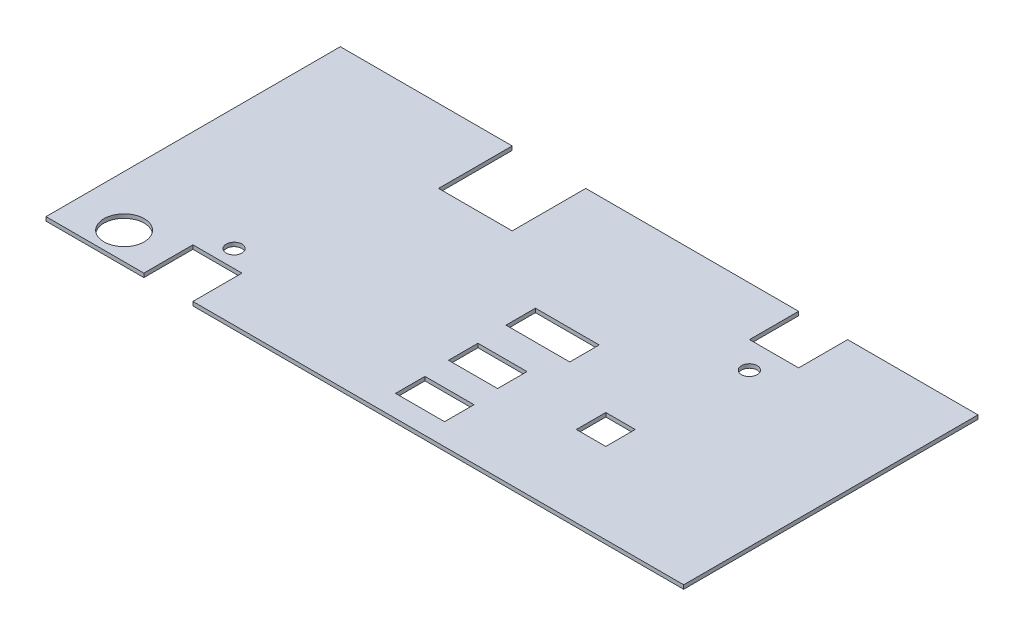
ISO-10303-21;
HEADER;
FILE_DESCRIPTION(('STEP AP214'),'2;1');
FILE_NAME('part.step','',(''),(''),'','','');
FILE_SCHEMA(('AUTOMOTIVE_DESIGN { 1 0 10303 214 1 1 1 1 }'));
ENDSEC;
DATA;
#1=APPLICATION_CONTEXT('core data for automotive mechanical design processes');
#2=APPLICATION_PROTOCOL_DEFINITION('international standard','automotive_design',2000,#1);
#3=PRODUCT_CONTEXT('',#1,'mechanical');
#4=PRODUCT('Part','Part','',(#3));
#5=PRODUCT_RELATED_PRODUCT_CATEGORY('part','',(#4));
#6=PRODUCT_DEFINITION_FORMATION('','',#4);
#7=PRODUCT_DEFINITION_CONTEXT('part definition',#1,'design');
#8=PRODUCT_DEFINITION('design','',#6,#7);
#9=PRODUCT_DEFINITION_SHAPE('','',#8);
#10=(LENGTH_UNIT() NAMED_UNIT(*) SI_UNIT(.MILLI.,.METRE.));
#11=(NAMED_UNIT(*) PLANE_ANGLE_UNIT() SI_UNIT($,.RADIAN.));
#12=(NAMED_UNIT(*) SI_UNIT($,.STERADIAN.) SOLID_ANGLE_UNIT());
#13=UNCERTAINTY_MEASURE_WITH_UNIT(LENGTH_MEASURE(1.E-05),#10,'distance_accuracy_value','');
#14=(GEOMETRIC_REPRESENTATION_CONTEXT(3) GLOBAL_UNCERTAINTY_ASSIGNED_CONTEXT((#13)) GLOBAL_UNIT_ASSIGNED_CONTEXT((#10,
#11,#12)) REPRESENTATION_CONTEXT('',''));
#15=CARTESIAN_POINT('',(0.,0.,0.));
#16=DIRECTION('',(0.,0.,1.));
#17=DIRECTION('',(1.,0.,0.));
#18=AXIS2_PLACEMENT_3D('',#15,#16,#17);
#19=CARTESIAN_POINT('',(0.,0.8,0.));
#20=DIRECTION('',(0.,1.,0.));
#21=DIRECTION('',(0.,0.,1.));
#22=AXIS2_PLACEMENT_3D('',#19,#20,#21);
#23=PLANE('',#22);
#24=CARTESIAN_POINT('',(33.7947660043208,0.8,-14.5908429620137));
#25=DIRECTION('',(0.,1.,0.));
#26=DIRECTION('',(0.,0.,1.));
#27=AXIS2_PLACEMENT_3D('',#24,#25,#26);
#28=CIRCLE('',#27,1.6);
#29=CARTESIAN_POINT('',(33.7947660043208,0.8,-12.9908429620137));
#30=VERTEX_POINT('',#29);
#31=EDGE_CURVE('E384',#30,#30,#28,.T.);
#32=ORIENTED_EDGE('',*,*,#31,.F.);
#33=EDGE_LOOP('',(#32));
#34=FACE_BOUND('',#33,.T.);
#35=CARTESIAN_POINT('',(-54.636005030327,0.8,24.4481071776723));
#36=DIRECTION('',(0.,1.,0.));
#37=DIRECTION('',(0.,0.,1.));
#38=AXIS2_PLACEMENT_3D('',#35,#36,#37);
#39=CIRCLE('',#38,4.1);
#40=CARTESIAN_POINT('',(-54.636005030327,0.8,28.5481071776723));
#41=VERTEX_POINT('',#40);
#42=EDGE_CURVE('E383',#41,#41,#39,.T.);
#43=ORIENTED_EDGE('',*,*,#42,.F.);
#44=EDGE_LOOP('',(#43));
#45=FACE_BOUND('',#44,.T.);
#46=CARTESIAN_POINT('',(-40.1851229344211,0.8,16.4677693038138));
#47=DIRECTION('',(0.,1.,0.));
#48=DIRECTION('',(0.,0.,1.));
#49=AXIS2_PLACEMENT_3D('',#46,#47,#48);
#50=CIRCLE('',#49,1.6);
#51=CARTESIAN_POINT('',(-40.1851229344211,0.8,18.0677693038138));
#52=VERTEX_POINT('',#51);
#53=EDGE_CURVE('E390',#52,#52,#50,.T.);
#54=ORIENTED_EDGE('',*,*,#53,.F.);
#55=EDGE_LOOP('',(#54));
#56=FACE_BOUND('',#55,.T.);
#57=DIRECTION('',(-1.,0.,0.));
#58=VECTOR('',#57,1.);
#59=CARTESIAN_POINT('',(-65.,0.8,-30.));
#60=LINE('',#59,#58);
#61=CARTESIAN_POINT('',(65.,0.8,-30.));
#62=VERTEX_POINT('',#61);
#63=CARTESIAN_POINT('',(38.4256480296742,0.8,-30.));
#64=VERTEX_POINT('',#63);
#65=EDGE_CURVE('E471',#62,#64,#60,.T.);
#66=ORIENTED_EDGE('',*,*,#65,.T.);
#67=DIRECTION('',(0.,0.,1.));
#68=VECTOR('',#67,1.);
#69=CARTESIAN_POINT('',(38.4256480296742,0.8,0.));
#70=LINE('',#69,#68);
#71=CARTESIAN_POINT('',(38.4256480296742,0.8,-20.0048506979894));
#72=VERTEX_POINT('',#71);
#73=EDGE_CURVE('E429',#64,#72,#70,.T.);
#74=ORIENTED_EDGE('',*,*,#73,.T.);
#75=DIRECTION('',(-1.,0.,0.));
#76=VECTOR('',#75,1.);
#77=CARTESIAN_POINT('',(0.,0.8,-20.0048506979894));
#78=LINE('',#77,#76);
#79=CARTESIAN_POINT('',(28.4256480296742,0.8,-20.0048506979894));
#80=VERTEX_POINT('',#79);
#81=EDGE_CURVE('E435',#72,#80,#78,.T.);
#82=ORIENTED_EDGE('',*,*,#81,.T.);
#83=DIRECTION('',(0.,0.,-1.));
#84=VECTOR('',#83,1.);
#85=CARTESIAN_POINT('',(28.4256480296742,0.8,0.));
#86=LINE('',#85,#84);
#87=CARTESIAN_POINT('',(28.4256480296742,0.8,-30.));
#88=VERTEX_POINT('',#87);
#89=EDGE_CURVE('E426',#80,#88,#86,.T.);
#90=ORIENTED_EDGE('',*,*,#89,.T.);
#91=CARTESIAN_POINT('',(-14.9608673840391,0.8,-30.));
#92=VERTEX_POINT('',#91);
#93=EDGE_CURVE('E475',#88,#92,#60,.T.);
#94=ORIENTED_EDGE('',*,*,#93,.T.);
#95=DIRECTION('',(0.,0.,1.));
#96=VECTOR('',#95,1.);
#97=CARTESIAN_POINT('',(-14.960867384039,0.8,0.));
#98=LINE('',#97,#96);
#99=CARTESIAN_POINT('',(-14.960867384039,0.8,-15.));
#100=VERTEX_POINT('',#99);
#101=EDGE_CURVE('E423',#92,#100,#98,.T.);
#102=ORIENTED_EDGE('',*,*,#101,.T.);
#103=DIRECTION('',(-1.,0.,0.));
#104=VECTOR('',#103,1.);
#105=CARTESIAN_POINT('',(0.,0.8,-15.));
#106=LINE('',#105,#104);
#107=CARTESIAN_POINT('',(-29.960867384039,0.8,-15.));
#108=VERTEX_POINT('',#107);
#109=EDGE_CURVE('E432',#100,#108,#106,.T.);
#110=ORIENTED_EDGE('',*,*,#109,.T.);
#111=DIRECTION('',(0.,0.,-1.));
#112=VECTOR('',#111,1.);
#113=CARTESIAN_POINT('',(-29.960867384039,0.8,0.));
#114=LINE('',#113,#112);
#115=CARTESIAN_POINT('',(-29.9608673840391,0.8,-30.));
#116=VERTEX_POINT('',#115);
#117=EDGE_CURVE('E408',#108,#116,#114,.T.);
#118=ORIENTED_EDGE('',*,*,#117,.T.);
#119=CARTESIAN_POINT('',(-65.,0.8,-30.));
#120=VERTEX_POINT('',#119);
#121=EDGE_CURVE('E469',#116,#120,#60,.T.);
#122=ORIENTED_EDGE('',*,*,#121,.T.);
#123=DIRECTION('',(0.,0.,1.));
#124=VECTOR('',#123,1.);
#125=CARTESIAN_POINT('',(-65.,0.8,-30.));
#126=LINE('',#125,#124);
#127=CARTESIAN_POINT('',(-65.,0.8,30.));
#128=VERTEX_POINT('',#127);
#129=EDGE_CURVE('E474',#120,#128,#126,.T.);
#130=ORIENTED_EDGE('',*,*,#129,.T.);
#131=DIRECTION('',(1.,0.,0.));
#132=VECTOR('',#131,1.);
#133=CARTESIAN_POINT('',(-65.,0.8,30.));
#134=LINE('',#133,#132);
#135=CARTESIAN_POINT('',(-45.0488340119398,0.8,30.));
#136=VERTEX_POINT('',#135);
#137=EDGE_CURVE('E478',#128,#136,#134,.T.);
#138=ORIENTED_EDGE('',*,*,#137,.T.);
#139=DIRECTION('',(0.,0.,-1.));
#140=VECTOR('',#139,1.);
#141=CARTESIAN_POINT('',(-45.0488340119398,0.8,0.));
#142=LINE('',#141,#140);
#143=CARTESIAN_POINT('',(-45.0488340119398,0.8,20.));
#144=VERTEX_POINT('',#143);
#145=EDGE_CURVE('E456',#136,#144,#142,.T.);
#146=ORIENTED_EDGE('',*,*,#145,.T.);
#147=DIRECTION('',(1.,0.,0.));
#148=VECTOR('',#147,1.);
#149=CARTESIAN_POINT('',(0.,0.8,20.));
#150=LINE('',#149,#148);
#151=CARTESIAN_POINT('',(-35.0488340119398,0.8,20.));
#152=VERTEX_POINT('',#151);
#153=EDGE_CURVE('E459',#144,#152,#150,.T.);
#154=ORIENTED_EDGE('',*,*,#153,.T.);
#155=DIRECTION('',(0.,0.,1.));
#156=VECTOR('',#155,1.);
#157=CARTESIAN_POINT('',(-35.0488340119398,0.8,0.));
#158=LINE('',#157,#156);
#159=CARTESIAN_POINT('',(-35.0488340119398,0.8,30.));
#160=VERTEX_POINT('',#159);
#161=EDGE_CURVE('E462',#152,#160,#158,.T.);
#162=ORIENTED_EDGE('',*,*,#161,.T.);
#163=CARTESIAN_POINT('',(65.,0.8,30.));
#164=VERTEX_POINT('',#163);
#165=EDGE_CURVE('E477',#160,#164,#134,.T.);
#166=ORIENTED_EDGE('',*,*,#165,.T.);
#167=DIRECTION('',(0.,0.,-1.));
#168=VECTOR('',#167,1.);
#169=CARTESIAN_POINT('',(65.,0.8,-30.));
#170=LINE('',#169,#168);
#171=EDGE_CURVE('E466',#164,#62,#170,.T.);
#172=ORIENTED_EDGE('',*,*,#171,.T.);
#173=EDGE_LOOP('',(#66,#74,#82,#90,#94,#102,#110,#118,#122,#130,#138,#146,#154,#162,#166,#172));
#174=FACE_BOUND('',#173,.T.);
#175=DIRECTION('',(1.,0.,0.));
#176=VECTOR('',#175,1.);
#177=CARTESIAN_POINT('',(0.,0.8,-3.72856260857962));
#178=LINE('',#177,#176);
#179=CARTESIAN_POINT('',(1.04756517794882,0.8,-3.72856260857962));
#180=VERTEX_POINT('',#179);
#181=CARTESIAN_POINT('',(14.0475651779488,0.8,-3.72856260857962));
#182=VERTEX_POINT('',#181);
#183=EDGE_CURVE('E377',#180,#182,#178,.T.);
#184=ORIENTED_EDGE('',*,*,#183,.T.);
#185=DIRECTION('',(0.,0.,1.));
#186=VECTOR('',#185,1.);
#187=CARTESIAN_POINT('',(14.0475651779488,0.8,0.));
#188=LINE('',#187,#186);
#189=CARTESIAN_POINT('',(14.0475651779488,0.8,2.27143739142038));
#190=VERTEX_POINT('',#189);
#191=EDGE_CURVE('E380',#182,#190,#188,.T.);
#192=ORIENTED_EDGE('',*,*,#191,.T.);
#193=DIRECTION('',(-1.,0.,0.));
#194=VECTOR('',#193,1.);
#195=CARTESIAN_POINT('',(0.,0.8,2.27143739142038));
#196=LINE('',#195,#194);
#197=CARTESIAN_POINT('',(1.04756517794882,0.8,2.27143739142038));
#198=VERTEX_POINT('',#197);
#199=EDGE_CURVE('E371',#190,#198,#196,.T.);
#200=ORIENTED_EDGE('',*,*,#199,.T.);
#201=DIRECTION('',(0.,0.,-1.));
#202=VECTOR('',#201,1.);
#203=CARTESIAN_POINT('',(1.04756517794882,0.8,0.));
#204=LINE('',#203,#202);
#205=EDGE_CURVE('E374',#198,#180,#204,.T.);
#206=ORIENTED_EDGE('',*,*,#205,.T.);
#207=EDGE_LOOP('',(#184,#192,#200,#206));
#208=FACE_BOUND('',#207,.T.);
#209=DIRECTION('',(1.,0.,0.));
#210=VECTOR('',#209,1.);
#211=CARTESIAN_POINT('',(0.,0.8,8.32705702731477));
#212=LINE('',#211,#210);
#213=CARTESIAN_POINT('',(1.38614363778386,0.8,8.32705702731477));
#214=VERTEX_POINT('',#213);
#215=CARTESIAN_POINT('',(11.3861436377839,0.8,8.32705702731477));
#216=VERTEX_POINT('',#215);
#217=EDGE_CURVE('E323',#214,#216,#212,.T.);
#218=ORIENTED_EDGE('',*,*,#217,.T.);
#219=DIRECTION('',(0.,0.,1.));
#220=VECTOR('',#219,1.);
#221=CARTESIAN_POINT('',(11.3861436377839,0.8,0.));
#222=LINE('',#221,#220);
#223=CARTESIAN_POINT('',(11.3861436377839,0.8,14.3270570273148));
#224=VERTEX_POINT('',#223);
#225=EDGE_CURVE('E326',#216,#224,#222,.T.);
#226=ORIENTED_EDGE('',*,*,#225,.T.);
#227=DIRECTION('',(-1.,0.,0.));
#228=VECTOR('',#227,1.);
#229=CARTESIAN_POINT('',(0.,0.8,14.3270570273148));
#230=LINE('',#229,#228);
#231=CARTESIAN_POINT('',(1.38614363778386,0.8,14.3270570273148));
#232=VERTEX_POINT('',#231);
#233=EDGE_CURVE('E317',#224,#232,#230,.T.);
#234=ORIENTED_EDGE('',*,*,#233,.T.);
#235=DIRECTION('',(0.,0.,-1.));
#236=VECTOR('',#235,1.);
#237=CARTESIAN_POINT('',(1.38614363778386,0.8,0.));
#238=LINE('',#237,#236);
#239=EDGE_CURVE('E320',#232,#214,#238,.T.);
#240=ORIENTED_EDGE('',*,*,#239,.T.);
#241=EDGE_LOOP('',(#218,#226,#234,#240));
#242=FACE_BOUND('',#241,.T.);
#243=DIRECTION('',(1.,0.,0.));
#244=VECTOR('',#243,1.);
#245=CARTESIAN_POINT('',(0.,0.8,19.5801073360517));
#246=LINE('',#245,#244);
#247=CARTESIAN_POINT('',(1.83092823496713,0.8,19.5801073360517));
#248=VERTEX_POINT('',#247);
#249=CARTESIAN_POINT('',(11.8309282349671,0.8,19.5801073360517));
#250=VERTEX_POINT('',#249);
#251=EDGE_CURVE('E335',#248,#250,#246,.T.);
#252=ORIENTED_EDGE('',*,*,#251,.T.);
#253=DIRECTION('',(0.,0.,1.));
#254=VECTOR('',#253,1.);
#255=CARTESIAN_POINT('',(11.8309282349671,0.8,0.));
#256=LINE('',#255,#254);
#257=CARTESIAN_POINT('',(11.8309282349671,0.8,25.5801073360517));
#258=VERTEX_POINT('',#257);
#259=EDGE_CURVE('E250',#250,#258,#256,.T.);
#260=ORIENTED_EDGE('',*,*,#259,.T.);
#261=DIRECTION('',(-1.,0.,0.));
#262=VECTOR('',#261,1.);
#263=CARTESIAN_POINT('',(0.,0.8,25.5801073360517));
#264=LINE('',#263,#262);
#265=CARTESIAN_POINT('',(1.83092823496713,0.8,25.5801073360517));
#266=VERTEX_POINT('',#265);
#267=EDGE_CURVE('E329',#258,#266,#264,.T.);
#268=ORIENTED_EDGE('',*,*,#267,.T.);
#269=DIRECTION('',(0.,0.,-1.));
#270=VECTOR('',#269,1.);
#271=CARTESIAN_POINT('',(1.83092823496713,0.8,0.));
#272=LINE('',#271,#270);
#273=EDGE_CURVE('E332',#266,#248,#272,.T.);
#274=ORIENTED_EDGE('',*,*,#273,.T.);
#275=EDGE_LOOP('',(#252,#260,#268,#274));
#276=FACE_BOUND('',#275,.T.);
#277=DIRECTION('',(1.,0.,0.));
#278=VECTOR('',#277,1.);
#279=CARTESIAN_POINT('',(0.,0.8,7.51992345414904));
#280=LINE('',#279,#278);
#281=CARTESIAN_POINT('',(26.6403126055567,0.8,7.51992345414904));
#282=VERTEX_POINT('',#281);
#283=CARTESIAN_POINT('',(32.6403126055567,0.8,7.51992345414904));
#284=VERTEX_POINT('',#283);
#285=EDGE_CURVE('E344',#282,#284,#280,.T.);
#286=ORIENTED_EDGE('',*,*,#285,.T.);
#287=DIRECTION('',(0.,0.,1.));
#288=VECTOR('',#287,1.);
#289=CARTESIAN_POINT('',(32.6403126055567,0.8,0.));
#290=LINE('',#289,#288);
#291=CARTESIAN_POINT('',(32.6403126055567,0.8,13.519923454149));
#292=VERTEX_POINT('',#291);
#293=EDGE_CURVE('E347',#284,#292,#290,.T.);
#294=ORIENTED_EDGE('',*,*,#293,.T.);
#295=DIRECTION('',(-1.,0.,0.));
#296=VECTOR('',#295,1.);
#297=CARTESIAN_POINT('',(0.,0.8,13.519923454149));
#298=LINE('',#297,#296);
#299=CARTESIAN_POINT('',(26.6403126055567,0.8,13.519923454149));
#300=VERTEX_POINT('',#299);
#301=EDGE_CURVE('E338',#292,#300,#298,.T.);
#302=ORIENTED_EDGE('',*,*,#301,.T.);
#303=DIRECTION('',(0.,0.,-1.));
#304=VECTOR('',#303,1.);
#305=CARTESIAN_POINT('',(26.6403126055567,0.8,0.));
#306=LINE('',#305,#304);
#307=EDGE_CURVE('E341',#300,#282,#306,.T.);
#308=ORIENTED_EDGE('',*,*,#307,.T.);
#309=EDGE_LOOP('',(#286,#294,#302,#308));
#310=FACE_BOUND('',#309,.T.);
#311=ADVANCED_FACE('F33',(#34,#45,#56,#174,#208,#242,#276,#310),#23,.T.);
#312=CARTESIAN_POINT('',(0.,0.,0.));
#313=DIRECTION('',(0.,1.,0.));
#314=DIRECTION('',(0.,0.,1.));
#315=AXIS2_PLACEMENT_3D('',#312,#313,#314);
#316=PLANE('',#315);
#317=DIRECTION('',(0.,0.,-1.));
#318=VECTOR('',#317,1.);
#319=CARTESIAN_POINT('',(11.8309282349671,0.,19.5801073360517));
#320=LINE('',#319,#318);
#321=CARTESIAN_POINT('',(11.8309282349671,0.,25.5801073360517));
#322=VERTEX_POINT('',#321);
#323=CARTESIAN_POINT('',(11.8309282349671,0.,19.5801073360517));
#324=VERTEX_POINT('',#323);
#325=EDGE_CURVE('E247',#322,#324,#320,.T.);
#326=ORIENTED_EDGE('',*,*,#325,.T.);
#327=DIRECTION('',(-1.,0.,0.));
#328=VECTOR('',#327,1.);
#329=CARTESIAN_POINT('',(1.83092823496713,0.,19.5801073360517));
#330=LINE('',#329,#328);
#331=CARTESIAN_POINT('',(1.83092823496713,0.,19.5801073360517));
#332=VERTEX_POINT('',#331);
#333=EDGE_CURVE('E257',#324,#332,#330,.T.);
#334=ORIENTED_EDGE('',*,*,#333,.T.);
#335=DIRECTION('',(0.,0.,1.));
#336=VECTOR('',#335,1.);
#337=CARTESIAN_POINT('',(1.83092823496713,0.,19.5801073360517));
#338=LINE('',#337,#336);
#339=CARTESIAN_POINT('',(1.83092823496713,0.,25.5801073360517));
#340=VERTEX_POINT('',#339);
#341=EDGE_CURVE('E263',#332,#340,#338,.T.);
#342=ORIENTED_EDGE('',*,*,#341,.T.);
#343=DIRECTION('',(1.,0.,0.));
#344=VECTOR('',#343,1.);
#345=CARTESIAN_POINT('',(1.83092823496713,0.,25.5801073360517));
#346=LINE('',#345,#344);
#347=EDGE_CURVE('E268',#340,#322,#346,.T.);
#348=ORIENTED_EDGE('',*,*,#347,.T.);
#349=EDGE_LOOP('',(#326,#334,#342,#348));
#350=FACE_BOUND('',#349,.T.);
#351=DIRECTION('',(0.,0.,-1.));
#352=VECTOR('',#351,1.);
#353=CARTESIAN_POINT('',(14.0475651779488,0.,-3.72856260857962));
#354=LINE('',#353,#352);
#355=CARTESIAN_POINT('',(14.0475651779488,0.,2.27143739142038));
#356=VERTEX_POINT('',#355);
#357=CARTESIAN_POINT('',(14.0475651779488,0.,-3.72856260857962));
#358=VERTEX_POINT('',#357);
#359=EDGE_CURVE('E350',#356,#358,#354,.T.);
#360=ORIENTED_EDGE('',*,*,#359,.T.);
#361=DIRECTION('',(-1.,0.,0.));
#362=VECTOR('',#361,1.);
#363=CARTESIAN_POINT('',(1.04756517794882,0.,-3.72856260857962));
#364=LINE('',#363,#362);
#365=CARTESIAN_POINT('',(1.04756517794882,0.,-3.72856260857962));
#366=VERTEX_POINT('',#365);
#367=EDGE_CURVE('E353',#358,#366,#364,.T.);
#368=ORIENTED_EDGE('',*,*,#367,.T.);
#369=DIRECTION('',(0.,0.,1.));
#370=VECTOR('',#369,1.);
#371=CARTESIAN_POINT('',(1.04756517794882,0.,-3.72856260857962));
#372=LINE('',#371,#370);
#373=CARTESIAN_POINT('',(1.04756517794882,0.,2.27143739142038));
#374=VERTEX_POINT('',#373);
#375=EDGE_CURVE('E356',#366,#374,#372,.T.);
#376=ORIENTED_EDGE('',*,*,#375,.T.);
#377=DIRECTION('',(1.,0.,0.));
#378=VECTOR('',#377,1.);
#379=CARTESIAN_POINT('',(1.04756517794882,0.,2.27143739142038));
#380=LINE('',#379,#378);
#381=EDGE_CURVE('E359',#374,#356,#380,.T.);
#382=ORIENTED_EDGE('',*,*,#381,.T.);
#383=EDGE_LOOP('',(#360,#368,#376,#382));
#384=FACE_BOUND('',#383,.T.);
#385=CARTESIAN_POINT('',(33.7947660043208,0.,-14.5908429620137));
#386=DIRECTION('',(0.,1.,0.));
#387=DIRECTION('',(0.,0.,1.));
#388=AXIS2_PLACEMENT_3D('',#385,#386,#387);
#389=CIRCLE('',#388,1.6);
#390=CARTESIAN_POINT('',(33.7947660043208,0.,-12.9908429620137));
#391=VERTEX_POINT('',#390);
#392=EDGE_CURVE('E37',#391,#391,#389,.T.);
#393=ORIENTED_EDGE('',*,*,#392,.T.);
#394=EDGE_LOOP('',(#393));
#395=FACE_BOUND('',#394,.T.);
#396=CARTESIAN_POINT('',(-54.636005030327,0.,24.4481071776723));
#397=DIRECTION('',(0.,1.,0.));
#398=DIRECTION('',(0.,0.,1.));
#399=AXIS2_PLACEMENT_3D('',#396,#397,#398);
#400=CIRCLE('',#399,4.1);
#401=CARTESIAN_POINT('',(-54.636005030327,0.,28.5481071776723));
#402=VERTEX_POINT('',#401);
#403=EDGE_CURVE('E387',#402,#402,#400,.T.);
#404=ORIENTED_EDGE('',*,*,#403,.T.);
#405=EDGE_LOOP('',(#404));
#406=FACE_BOUND('',#405,.T.);
#407=CARTESIAN_POINT('',(-40.1851229344211,0.,16.4677693038138));
#408=DIRECTION('',(0.,1.,0.));
#409=DIRECTION('',(0.,0.,1.));
#410=AXIS2_PLACEMENT_3D('',#407,#408,#409);
#411=CIRCLE('',#410,1.6);
#412=CARTESIAN_POINT('',(-40.1851229344211,0.,18.0677693038138));
#413=VERTEX_POINT('',#412);
#414=EDGE_CURVE('E393',#413,#413,#411,.T.);
#415=ORIENTED_EDGE('',*,*,#414,.T.);
#416=EDGE_LOOP('',(#415));
#417=FACE_BOUND('',#416,.T.);
#418=DIRECTION('',(0.,0.,-1.));
#419=VECTOR('',#418,1.);
#420=CARTESIAN_POINT('',(38.4256480296742,0.,-30.0048506979894));
#421=LINE('',#420,#419);
#422=CARTESIAN_POINT('',(38.4256480296742,0.,-20.0048506979894));
#423=VERTEX_POINT('',#422);
#424=CARTESIAN_POINT('',(38.4256480296742,0.,-30.));
#425=VERTEX_POINT('',#424);
#426=EDGE_CURVE('E394',#423,#425,#421,.T.);
#427=ORIENTED_EDGE('',*,*,#426,.T.);
#428=DIRECTION('',(-1.,0.,0.));
#429=VECTOR('',#428,1.);
#430=CARTESIAN_POINT('',(-65.,0.,-30.));
#431=LINE('',#430,#429);
#432=CARTESIAN_POINT('',(65.,0.,-30.));
#433=VERTEX_POINT('',#432);
#434=EDGE_CURVE('E485',#433,#425,#431,.T.);
#435=ORIENTED_EDGE('',*,*,#434,.F.);
#436=DIRECTION('',(0.,0.,-1.));
#437=VECTOR('',#436,1.);
#438=CARTESIAN_POINT('',(65.,0.,-30.));
#439=LINE('',#438,#437);
#440=CARTESIAN_POINT('',(65.,0.,30.));
#441=VERTEX_POINT('',#440);
#442=EDGE_CURVE('E465',#441,#433,#439,.T.);
#443=ORIENTED_EDGE('',*,*,#442,.F.);
#444=DIRECTION('',(1.,0.,0.));
#445=VECTOR('',#444,1.);
#446=CARTESIAN_POINT('',(-65.,0.,30.));
#447=LINE('',#446,#445);
#448=CARTESIAN_POINT('',(-35.0488340119398,0.,30.));
#449=VERTEX_POINT('',#448);
#450=EDGE_CURVE('E491',#449,#441,#447,.T.);
#451=ORIENTED_EDGE('',*,*,#450,.F.);
#452=DIRECTION('',(0.,0.,-1.));
#453=VECTOR('',#452,1.);
#454=CARTESIAN_POINT('',(-35.0488340119398,0.,20.));
#455=LINE('',#454,#453);
#456=CARTESIAN_POINT('',(-35.0488340119398,0.,20.));
#457=VERTEX_POINT('',#456);
#458=EDGE_CURVE('E438',#449,#457,#455,.T.);
#459=ORIENTED_EDGE('',*,*,#458,.T.);
#460=DIRECTION('',(-1.,0.,0.));
#461=VECTOR('',#460,1.);
#462=CARTESIAN_POINT('',(-45.0488340119398,0.,20.));
#463=LINE('',#462,#461);
#464=CARTESIAN_POINT('',(-45.0488340119398,0.,20.));
#465=VERTEX_POINT('',#464);
#466=EDGE_CURVE('E441',#457,#465,#463,.T.);
#467=ORIENTED_EDGE('',*,*,#466,.T.);
#468=DIRECTION('',(0.,0.,1.));
#469=VECTOR('',#468,1.);
#470=CARTESIAN_POINT('',(-45.0488340119398,0.,20.));
#471=LINE('',#470,#469);
#472=CARTESIAN_POINT('',(-45.0488340119398,0.,30.));
#473=VERTEX_POINT('',#472);
#474=EDGE_CURVE('E444',#465,#473,#471,.T.);
#475=ORIENTED_EDGE('',*,*,#474,.T.);
#476=CARTESIAN_POINT('',(-65.,0.,30.));
#477=VERTEX_POINT('',#476);
#478=EDGE_CURVE('E470',#477,#473,#447,.T.);
#479=ORIENTED_EDGE('',*,*,#478,.F.);
#480=DIRECTION('',(0.,0.,1.));
#481=VECTOR('',#480,1.);
#482=CARTESIAN_POINT('',(-65.,0.,-30.));
#483=LINE('',#482,#481);
#484=CARTESIAN_POINT('',(-65.,0.,-30.));
#485=VERTEX_POINT('',#484);
#486=EDGE_CURVE('E488',#485,#477,#483,.T.);
#487=ORIENTED_EDGE('',*,*,#486,.F.);
#488=CARTESIAN_POINT('',(-29.9608673840391,0.,-30.));
#489=VERTEX_POINT('',#488);
#490=EDGE_CURVE('E484',#489,#485,#431,.T.);
#491=ORIENTED_EDGE('',*,*,#490,.F.);
#492=DIRECTION('',(0.,0.,1.));
#493=VECTOR('',#492,1.);
#494=CARTESIAN_POINT('',(-29.9608673840391,0.,-30.));
#495=LINE('',#494,#493);
#496=CARTESIAN_POINT('',(-29.960867384039,0.,-15.));
#497=VERTEX_POINT('',#496);
#498=EDGE_CURVE('E412',#489,#497,#495,.T.);
#499=ORIENTED_EDGE('',*,*,#498,.T.);
#500=DIRECTION('',(1.,0.,0.));
#501=VECTOR('',#500,1.);
#502=CARTESIAN_POINT('',(-29.960867384039,0.,-15.));
#503=LINE('',#502,#501);
#504=CARTESIAN_POINT('',(-14.960867384039,0.,-15.));
#505=VERTEX_POINT('',#504);
#506=EDGE_CURVE('E415',#497,#505,#503,.T.);
#507=ORIENTED_EDGE('',*,*,#506,.T.);
#508=DIRECTION('',(0.,0.,-1.));
#509=VECTOR('',#508,1.);
#510=CARTESIAN_POINT('',(-14.9608673840391,0.,-30.));
#511=LINE('',#510,#509);
#512=CARTESIAN_POINT('',(-14.9608673840391,0.,-30.));
#513=VERTEX_POINT('',#512);
#514=EDGE_CURVE('E409',#505,#513,#511,.T.);
#515=ORIENTED_EDGE('',*,*,#514,.T.);
#516=CARTESIAN_POINT('',(28.4256480296742,0.,-30.));
#517=VERTEX_POINT('',#516);
#518=EDGE_CURVE('E489',#517,#513,#431,.T.);
#519=ORIENTED_EDGE('',*,*,#518,.F.);
#520=DIRECTION('',(0.,0.,1.));
#521=VECTOR('',#520,1.);
#522=CARTESIAN_POINT('',(28.4256480296742,0.,-30.0048506979894));
#523=LINE('',#522,#521);
#524=CARTESIAN_POINT('',(28.4256480296742,0.,-20.0048506979894));
#525=VERTEX_POINT('',#524);
#526=EDGE_CURVE('E397',#517,#525,#523,.T.);
#527=ORIENTED_EDGE('',*,*,#526,.T.);
#528=DIRECTION('',(1.,0.,0.));
#529=VECTOR('',#528,1.);
#530=CARTESIAN_POINT('',(28.4256480296742,0.,-20.0048506979894));
#531=LINE('',#530,#529);
#532=EDGE_CURVE('E401',#525,#423,#531,.T.);
#533=ORIENTED_EDGE('',*,*,#532,.T.);
#534=EDGE_LOOP('',(#427,#435,#443,#451,#459,#467,#475,#479,#487,#491,#499,#507,#515,#519,#527,#533));
#535=FACE_BOUND('',#534,.T.);
#536=DIRECTION('',(0.,0.,-1.));
#537=VECTOR('',#536,1.);
#538=CARTESIAN_POINT('',(11.3861436377839,0.,8.32705702731477));
#539=LINE('',#538,#537);
#540=CARTESIAN_POINT('',(11.3861436377839,0.,14.3270570273148));
#541=VERTEX_POINT('',#540);
#542=CARTESIAN_POINT('',(11.3861436377839,0.,8.32705702731477));
#543=VERTEX_POINT('',#542);
#544=EDGE_CURVE('E253',#541,#543,#539,.T.);
#545=ORIENTED_EDGE('',*,*,#544,.T.);
#546=DIRECTION('',(-1.,0.,0.));
#547=VECTOR('',#546,1.);
#548=CARTESIAN_POINT('',(1.38614363778386,0.,8.32705702731477));
#549=LINE('',#548,#547);
#550=CARTESIAN_POINT('',(1.38614363778386,0.,8.32705702731477));
#551=VERTEX_POINT('',#550);
#552=EDGE_CURVE('E299',#543,#551,#549,.T.);
#553=ORIENTED_EDGE('',*,*,#552,.T.);
#554=DIRECTION('',(0.,0.,1.));
#555=VECTOR('',#554,1.);
#556=CARTESIAN_POINT('',(1.38614363778386,0.,8.32705702731477));
#557=LINE('',#556,#555);
#558=CARTESIAN_POINT('',(1.38614363778386,0.,14.3270570273148));
#559=VERTEX_POINT('',#558);
#560=EDGE_CURVE('E302',#551,#559,#557,.T.);
#561=ORIENTED_EDGE('',*,*,#560,.T.);
#562=DIRECTION('',(1.,0.,0.));
#563=VECTOR('',#562,1.);
#564=CARTESIAN_POINT('',(1.38614363778386,0.,14.3270570273148));
#565=LINE('',#564,#563);
#566=EDGE_CURVE('E305',#559,#541,#565,.T.);
#567=ORIENTED_EDGE('',*,*,#566,.T.);
#568=EDGE_LOOP('',(#545,#553,#561,#567));
#569=FACE_BOUND('',#568,.T.);
#570=DIRECTION('',(0.,0.,-1.));
#571=VECTOR('',#570,1.);
#572=CARTESIAN_POINT('',(32.6403126055567,0.,7.51992345414904));
#573=LINE('',#572,#571);
#574=CARTESIAN_POINT('',(32.6403126055567,0.,13.519923454149));
#575=VERTEX_POINT('',#574);
#576=CARTESIAN_POINT('',(32.6403126055567,0.,7.51992345414904));
#577=VERTEX_POINT('',#576);
#578=EDGE_CURVE('E280',#575,#577,#573,.T.);
#579=ORIENTED_EDGE('',*,*,#578,.T.);
#580=DIRECTION('',(-1.,0.,0.));
#581=VECTOR('',#580,1.);
#582=CARTESIAN_POINT('',(26.6403126055567,0.,7.51992345414904));
#583=LINE('',#582,#581);
#584=CARTESIAN_POINT('',(26.6403126055567,0.,7.51992345414904));
#585=VERTEX_POINT('',#584);
#586=EDGE_CURVE('E283',#577,#585,#583,.T.);
#587=ORIENTED_EDGE('',*,*,#586,.T.);
#588=DIRECTION('',(0.,0.,1.));
#589=VECTOR('',#588,1.);
#590=CARTESIAN_POINT('',(26.6403126055567,0.,7.51992345414904));
#591=LINE('',#590,#589);
#592=CARTESIAN_POINT('',(26.6403126055567,0.,13.519923454149));
#593=VERTEX_POINT('',#592);
#594=EDGE_CURVE('E286',#585,#593,#591,.T.);
#595=ORIENTED_EDGE('',*,*,#594,.T.);
#596=DIRECTION('',(1.,0.,0.));
#597=VECTOR('',#596,1.);
#598=CARTESIAN_POINT('',(26.6403126055567,0.,13.519923454149));
#599=LINE('',#598,#597);
#600=EDGE_CURVE('E289',#593,#575,#599,.T.);
#601=ORIENTED_EDGE('',*,*,#600,.T.);
#602=EDGE_LOOP('',(#579,#587,#595,#601));
#603=FACE_BOUND('',#602,.T.);
#604=ADVANCED_FACE('F266',(#350,#384,#395,#406,#417,#535,#569,#603),#316,.F.);
#605=CARTESIAN_POINT('',(-65.,0.8,-30.));
#606=DIRECTION('',(0.,0.,1.));
#607=DIRECTION('',(1.,0.,0.));
#608=AXIS2_PLACEMENT_3D('',#605,#606,#607);
#609=PLANE('',#608);
#610=DIRECTION('',(0.,-1.,0.));
#611=VECTOR('',#610,1.);
#612=CARTESIAN_POINT('',(38.4256480296742,0.8,-30.));
#613=LINE('',#612,#611);
#614=EDGE_CURVE('E11',#64,#425,#613,.T.);
#615=ORIENTED_EDGE('',*,*,#614,.F.);
#616=ORIENTED_EDGE('',*,*,#65,.F.);
#617=DIRECTION('',(0.,-1.,0.));
#618=VECTOR('',#617,1.);
#619=CARTESIAN_POINT('',(65.,0.8,-30.));
#620=LINE('',#619,#618);
#621=EDGE_CURVE('E502',#62,#433,#620,.T.);
#622=ORIENTED_EDGE('',*,*,#621,.T.);
#623=ORIENTED_EDGE('',*,*,#434,.T.);
#624=EDGE_LOOP('',(#615,#616,#622,#623));
#625=FACE_BOUND('',#624,.T.);
#626=ADVANCED_FACE('F540',(#625),#609,.F.);
#627=DIRECTION('',(0.,1.,0.));
#628=VECTOR('',#627,1.);
#629=CARTESIAN_POINT('',(28.4256480296742,0.8,-30.));
#630=LINE('',#629,#628);
#631=EDGE_CURVE('E42',#517,#88,#630,.T.);
#632=ORIENTED_EDGE('',*,*,#631,.F.);
#633=ORIENTED_EDGE('',*,*,#518,.T.);
#634=DIRECTION('',(0.,-1.,0.));
#635=VECTOR('',#634,1.);
#636=CARTESIAN_POINT('',(-14.9608673840391,0.8,-30.));
#637=LINE('',#636,#635);
#638=EDGE_CURVE('E507',#92,#513,#637,.T.);
#639=ORIENTED_EDGE('',*,*,#638,.F.);
#640=ORIENTED_EDGE('',*,*,#93,.F.);
#641=EDGE_LOOP('',(#632,#633,#639,#640));
#642=FACE_BOUND('',#641,.T.);
#643=ADVANCED_FACE('F558',(#642),#609,.F.);
#644=DIRECTION('',(0.,1.,0.));
#645=VECTOR('',#644,1.);
#646=CARTESIAN_POINT('',(-29.9608673840391,0.8,-30.));
#647=LINE('',#646,#645);
#648=EDGE_CURVE('E505',#489,#116,#647,.T.);
#649=ORIENTED_EDGE('',*,*,#648,.F.);
#650=ORIENTED_EDGE('',*,*,#490,.T.);
#651=DIRECTION('',(0.,-1.,0.));
#652=VECTOR('',#651,1.);
#653=CARTESIAN_POINT('',(-65.,0.8,-30.));
#654=LINE('',#653,#652);
#655=EDGE_CURVE('E499',#120,#485,#654,.T.);
#656=ORIENTED_EDGE('',*,*,#655,.F.);
#657=ORIENTED_EDGE('',*,*,#121,.F.);
#658=EDGE_LOOP('',(#649,#650,#656,#657));
#659=FACE_BOUND('',#658,.T.);
#660=ADVANCED_FACE('F552',(#659),#609,.F.);
#661=CARTESIAN_POINT('',(-65.,0.8,30.));
#662=DIRECTION('',(0.,0.,-1.));
#663=DIRECTION('',(-1.,0.,0.));
#664=AXIS2_PLACEMENT_3D('',#661,#662,#663);
#665=PLANE('',#664);
#666=DIRECTION('',(0.,-1.,0.));
#667=VECTOR('',#666,1.);
#668=CARTESIAN_POINT('',(-35.0488340119398,3.,30.));
#669=LINE('',#668,#667);
#670=EDGE_CURVE('E447',#160,#449,#669,.T.);
#671=ORIENTED_EDGE('',*,*,#670,.T.);
#672=ORIENTED_EDGE('',*,*,#450,.T.);
#673=DIRECTION('',(0.,-1.,0.));
#674=VECTOR('',#673,1.);
#675=CARTESIAN_POINT('',(65.,0.8,30.));
#676=LINE('',#675,#674);
#677=EDGE_CURVE('E481',#164,#441,#676,.T.);
#678=ORIENTED_EDGE('',*,*,#677,.F.);
#679=ORIENTED_EDGE('',*,*,#165,.F.);
#680=EDGE_LOOP('',(#671,#672,#678,#679));
#681=FACE_BOUND('',#680,.T.);
#682=ADVANCED_FACE('F548',(#681),#665,.F.);
#683=DIRECTION('',(0.,-1.,0.));
#684=VECTOR('',#683,1.);
#685=CARTESIAN_POINT('',(-45.0488340119398,3.,30.));
#686=LINE('',#685,#684);
#687=EDGE_CURVE('E450',#136,#473,#686,.T.);
#688=ORIENTED_EDGE('',*,*,#687,.F.);
#689=ORIENTED_EDGE('',*,*,#137,.F.);
#690=DIRECTION('',(0.,-1.,0.));
#691=VECTOR('',#690,1.);
#692=CARTESIAN_POINT('',(-65.,0.8,30.));
#693=LINE('',#692,#691);
#694=EDGE_CURVE('E496',#128,#477,#693,.T.);
#695=ORIENTED_EDGE('',*,*,#694,.T.);
#696=ORIENTED_EDGE('',*,*,#478,.T.);
#697=EDGE_LOOP('',(#688,#689,#695,#696));
#698=FACE_BOUND('',#697,.T.);
#699=ADVANCED_FACE('F551',(#698),#665,.F.);
#700=CARTESIAN_POINT('',(65.,0.8,-30.));
#701=DIRECTION('',(-1.,0.,0.));
#702=DIRECTION('',(0.,0.,1.));
#703=AXIS2_PLACEMENT_3D('',#700,#701,#702);
#704=PLANE('',#703);
#705=ORIENTED_EDGE('',*,*,#442,.T.);
#706=ORIENTED_EDGE('',*,*,#621,.F.);
#707=ORIENTED_EDGE('',*,*,#171,.F.);
#708=ORIENTED_EDGE('',*,*,#677,.T.);
#709=EDGE_LOOP('',(#705,#706,#707,#708));
#710=FACE_BOUND('',#709,.T.);
#711=ADVANCED_FACE('F35',(#710),#704,.F.);
#712=CARTESIAN_POINT('',(-65.,0.8,-30.));
#713=DIRECTION('',(1.,0.,0.));
#714=DIRECTION('',(0.,0.,-1.));
#715=AXIS2_PLACEMENT_3D('',#712,#713,#714);
#716=PLANE('',#715);
#717=ORIENTED_EDGE('',*,*,#486,.T.);
#718=ORIENTED_EDGE('',*,*,#694,.F.);
#719=ORIENTED_EDGE('',*,*,#129,.F.);
#720=ORIENTED_EDGE('',*,*,#655,.T.);
#721=EDGE_LOOP('',(#717,#718,#719,#720));
#722=FACE_BOUND('',#721,.T.);
#723=ADVANCED_FACE('F554',(#722),#716,.F.);
#724=CARTESIAN_POINT('',(-35.0488340119398,3.,20.));
#725=DIRECTION('',(-1.,0.,0.));
#726=DIRECTION('',(0.,0.,1.));
#727=AXIS2_PLACEMENT_3D('',#724,#725,#726);
#728=PLANE('',#727);
#729=DIRECTION('',(0.,-1.,0.));
#730=VECTOR('',#729,1.);
#731=CARTESIAN_POINT('',(-35.0488340119398,3.,20.));
#732=LINE('',#731,#730);
#733=EDGE_CURVE('E454',#152,#457,#732,.T.);
#734=ORIENTED_EDGE('',*,*,#733,.T.);
#735=ORIENTED_EDGE('',*,*,#458,.F.);
#736=ORIENTED_EDGE('',*,*,#670,.F.);
#737=ORIENTED_EDGE('',*,*,#161,.F.);
#738=EDGE_LOOP('',(#734,#735,#736,#737));
#739=FACE_BOUND('',#738,.T.);
#740=ADVANCED_FACE('F545',(#739),#728,.T.);
#741=CARTESIAN_POINT('',(-45.0488340119398,3.,20.));
#742=DIRECTION('',(0.,0.,1.));
#743=DIRECTION('',(1.,0.,0.));
#744=AXIS2_PLACEMENT_3D('',#741,#742,#743);
#745=PLANE('',#744);
#746=DIRECTION('',(0.,-1.,0.));
#747=VECTOR('',#746,1.);
#748=CARTESIAN_POINT('',(-45.0488340119398,3.,20.));
#749=LINE('',#748,#747);
#750=EDGE_CURVE('E452',#144,#465,#749,.T.);
#751=ORIENTED_EDGE('',*,*,#750,.T.);
#752=ORIENTED_EDGE('',*,*,#466,.F.);
#753=ORIENTED_EDGE('',*,*,#733,.F.);
#754=ORIENTED_EDGE('',*,*,#153,.F.);
#755=EDGE_LOOP('',(#751,#752,#753,#754));
#756=FACE_BOUND('',#755,.T.);
#757=ADVANCED_FACE('F602',(#756),#745,.T.);
#758=CARTESIAN_POINT('',(-45.0488340119398,3.,20.));
#759=DIRECTION('',(1.,0.,0.));
#760=DIRECTION('',(0.,0.,-1.));
#761=AXIS2_PLACEMENT_3D('',#758,#759,#760);
#762=PLANE('',#761);
#763=ORIENTED_EDGE('',*,*,#687,.T.);
#764=ORIENTED_EDGE('',*,*,#474,.F.);
#765=ORIENTED_EDGE('',*,*,#750,.F.);
#766=ORIENTED_EDGE('',*,*,#145,.F.);
#767=EDGE_LOOP('',(#763,#764,#765,#766));
#768=FACE_BOUND('',#767,.T.);
#769=ADVANCED_FACE('F598',(#768),#762,.T.);
#770=CARTESIAN_POINT('',(-14.9608673840391,3.,-30.));
#771=DIRECTION('',(-1.,0.,0.));
#772=DIRECTION('',(0.,0.,1.));
#773=AXIS2_PLACEMENT_3D('',#770,#771,#772);
#774=PLANE('',#773);
#775=ORIENTED_EDGE('',*,*,#638,.T.);
#776=ORIENTED_EDGE('',*,*,#514,.F.);
#777=DIRECTION('',(0.,-1.,0.));
#778=VECTOR('',#777,1.);
#779=CARTESIAN_POINT('',(-14.960867384039,3.,-15.));
#780=LINE('',#779,#778);
#781=EDGE_CURVE('E418',#100,#505,#780,.T.);
#782=ORIENTED_EDGE('',*,*,#781,.F.);
#783=ORIENTED_EDGE('',*,*,#101,.F.);
#784=EDGE_LOOP('',(#775,#776,#782,#783));
#785=FACE_BOUND('',#784,.T.);
#786=ADVANCED_FACE('F588',(#785),#774,.T.);
#787=CARTESIAN_POINT('',(-29.9608673840391,3.,-30.));
#788=DIRECTION('',(1.,0.,0.));
#789=DIRECTION('',(0.,0.,-1.));
#790=AXIS2_PLACEMENT_3D('',#787,#788,#789);
#791=PLANE('',#790);
#792=DIRECTION('',(0.,-1.,0.));
#793=VECTOR('',#792,1.);
#794=CARTESIAN_POINT('',(-29.960867384039,3.,-15.));
#795=LINE('',#794,#793);
#796=EDGE_CURVE('E398',#108,#497,#795,.T.);
#797=ORIENTED_EDGE('',*,*,#796,.T.);
#798=ORIENTED_EDGE('',*,*,#498,.F.);
#799=ORIENTED_EDGE('',*,*,#648,.T.);
#800=ORIENTED_EDGE('',*,*,#117,.F.);
#801=EDGE_LOOP('',(#797,#798,#799,#800));
#802=FACE_BOUND('',#801,.T.);
#803=ADVANCED_FACE('F635',(#802),#791,.T.);
#804=CARTESIAN_POINT('',(-29.960867384039,3.,-15.));
#805=DIRECTION('',(0.,0.,-1.));
#806=DIRECTION('',(-1.,0.,0.));
#807=AXIS2_PLACEMENT_3D('',#804,#805,#806);
#808=PLANE('',#807);
#809=ORIENTED_EDGE('',*,*,#781,.T.);
#810=ORIENTED_EDGE('',*,*,#506,.F.);
#811=ORIENTED_EDGE('',*,*,#796,.F.);
#812=ORIENTED_EDGE('',*,*,#109,.F.);
#813=EDGE_LOOP('',(#809,#810,#811,#812));
#814=FACE_BOUND('',#813,.T.);
#815=ADVANCED_FACE('F629',(#814),#808,.T.);
#816=CARTESIAN_POINT('',(38.4256480296742,3.,-30.0048506979894));
#817=DIRECTION('',(-1.,0.,0.));
#818=DIRECTION('',(0.,0.,1.));
#819=AXIS2_PLACEMENT_3D('',#816,#817,#818);
#820=PLANE('',#819);
#821=ORIENTED_EDGE('',*,*,#614,.T.);
#822=ORIENTED_EDGE('',*,*,#426,.F.);
#823=DIRECTION('',(0.,-1.,0.));
#824=VECTOR('',#823,1.);
#825=CARTESIAN_POINT('',(38.4256480296742,3.,-20.0048506979894));
#826=LINE('',#825,#824);
#827=EDGE_CURVE('E404',#72,#423,#826,.T.);
#828=ORIENTED_EDGE('',*,*,#827,.F.);
#829=ORIENTED_EDGE('',*,*,#73,.F.);
#830=EDGE_LOOP('',(#821,#822,#828,#829));
#831=FACE_BOUND('',#830,.T.);
#832=ADVANCED_FACE('F614',(#831),#820,.T.);
#833=CARTESIAN_POINT('',(28.4256480296742,3.,-30.0048506979894));
#834=DIRECTION('',(1.,0.,0.));
#835=DIRECTION('',(0.,0.,-1.));
#836=AXIS2_PLACEMENT_3D('',#833,#834,#835);
#837=PLANE('',#836);
#838=DIRECTION('',(0.,-1.,0.));
#839=VECTOR('',#838,1.);
#840=CARTESIAN_POINT('',(28.4256480296742,3.,-20.0048506979894));
#841=LINE('',#840,#839);
#842=EDGE_CURVE('E406',#80,#525,#841,.T.);
#843=ORIENTED_EDGE('',*,*,#842,.T.);
#844=ORIENTED_EDGE('',*,*,#526,.F.);
#845=ORIENTED_EDGE('',*,*,#631,.T.);
#846=ORIENTED_EDGE('',*,*,#89,.F.);
#847=EDGE_LOOP('',(#843,#844,#845,#846));
#848=FACE_BOUND('',#847,.T.);
#849=ADVANCED_FACE('F621',(#848),#837,.T.);
#850=CARTESIAN_POINT('',(28.4256480296742,3.,-20.0048506979894));
#851=DIRECTION('',(0.,0.,-1.));
#852=DIRECTION('',(-1.,0.,0.));
#853=AXIS2_PLACEMENT_3D('',#850,#851,#852);
#854=PLANE('',#853);
#855=ORIENTED_EDGE('',*,*,#827,.T.);
#856=ORIENTED_EDGE('',*,*,#532,.F.);
#857=ORIENTED_EDGE('',*,*,#842,.F.);
#858=ORIENTED_EDGE('',*,*,#81,.F.);
#859=EDGE_LOOP('',(#855,#856,#857,#858));
#860=FACE_BOUND('',#859,.T.);
#861=ADVANCED_FACE('F619',(#860),#854,.T.);
#862=CARTESIAN_POINT('',(-40.1851229344211,-2.2,16.4677693038138));
#863=DIRECTION('',(0.,1.,0.));
#864=DIRECTION('',(0.,0.,1.));
#865=AXIS2_PLACEMENT_3D('',#862,#863,#864);
#866=CYLINDRICAL_SURFACE('',#865,1.6);
#867=ORIENTED_EDGE('',*,*,#53,.T.);
#868=EDGE_LOOP('',(#867));
#869=FACE_BOUND('',#868,.T.);
#870=ORIENTED_EDGE('',*,*,#414,.F.);
#871=EDGE_LOOP('',(#870));
#872=FACE_BOUND('',#871,.T.);
#873=ADVANCED_FACE('F531',(#869,#872),#866,.F.);
#874=CARTESIAN_POINT('',(-54.636005030327,-2.2,24.4481071776723));
#875=DIRECTION('',(0.,1.,0.));
#876=DIRECTION('',(0.,0.,1.));
#877=AXIS2_PLACEMENT_3D('',#874,#875,#876);
#878=CYLINDRICAL_SURFACE('',#877,4.1);
#879=ORIENTED_EDGE('',*,*,#42,.T.);
#880=EDGE_LOOP('',(#879));
#881=FACE_BOUND('',#880,.T.);
#882=ORIENTED_EDGE('',*,*,#403,.F.);
#883=EDGE_LOOP('',(#882));
#884=FACE_BOUND('',#883,.T.);
#885=ADVANCED_FACE('F521',(#881,#884),#878,.F.);
#886=CARTESIAN_POINT('',(33.7947660043208,-2.2,-14.5908429620137));
#887=DIRECTION('',(0.,1.,0.));
#888=DIRECTION('',(0.,0.,1.));
#889=AXIS2_PLACEMENT_3D('',#886,#887,#888);
#890=CYLINDRICAL_SURFACE('',#889,1.6);
#891=ORIENTED_EDGE('',*,*,#31,.T.);
#892=EDGE_LOOP('',(#891));
#893=FACE_BOUND('',#892,.T.);
#894=ORIENTED_EDGE('',*,*,#392,.F.);
#895=EDGE_LOOP('',(#894));
#896=FACE_BOUND('',#895,.T.);
#897=ADVANCED_FACE('F518',(#893,#896),#890,.F.);
#898=CARTESIAN_POINT('',(14.0475651779488,3.,-3.72856260857962));
#899=DIRECTION('',(-1.,0.,0.));
#900=DIRECTION('',(0.,0.,1.));
#901=AXIS2_PLACEMENT_3D('',#898,#899,#900);
#902=PLANE('',#901);
#903=DIRECTION('',(0.,-1.,0.));
#904=VECTOR('',#903,1.);
#905=CARTESIAN_POINT('',(14.0475651779488,3.,-3.72856260857962));
#906=LINE('',#905,#904);
#907=EDGE_CURVE('E369',#182,#358,#906,.T.);
#908=ORIENTED_EDGE('',*,*,#907,.T.);
#909=ORIENTED_EDGE('',*,*,#359,.F.);
#910=DIRECTION('',(0.,-1.,0.));
#911=VECTOR('',#910,1.);
#912=CARTESIAN_POINT('',(14.0475651779488,3.,2.27143739142038));
#913=LINE('',#912,#911);
#914=EDGE_CURVE('E362',#190,#356,#913,.T.);
#915=ORIENTED_EDGE('',*,*,#914,.F.);
#916=ORIENTED_EDGE('',*,*,#191,.F.);
#917=EDGE_LOOP('',(#908,#909,#915,#916));
#918=FACE_BOUND('',#917,.T.);
#919=ADVANCED_FACE('F520',(#918),#902,.T.);
#920=CARTESIAN_POINT('',(1.04756517794882,3.,-3.72856260857962));
#921=DIRECTION('',(0.,0.,1.));
#922=DIRECTION('',(1.,0.,0.));
#923=AXIS2_PLACEMENT_3D('',#920,#921,#922);
#924=PLANE('',#923);
#925=DIRECTION('',(0.,-1.,0.));
#926=VECTOR('',#925,1.);
#927=CARTESIAN_POINT('',(1.04756517794882,3.,-3.72856260857962));
#928=LINE('',#927,#926);
#929=EDGE_CURVE('E367',#180,#366,#928,.T.);
#930=ORIENTED_EDGE('',*,*,#929,.T.);
#931=ORIENTED_EDGE('',*,*,#367,.F.);
#932=ORIENTED_EDGE('',*,*,#907,.F.);
#933=ORIENTED_EDGE('',*,*,#183,.F.);
#934=EDGE_LOOP('',(#930,#931,#932,#933));
#935=FACE_BOUND('',#934,.T.);
#936=ADVANCED_FACE('F528',(#935),#924,.T.);
#937=CARTESIAN_POINT('',(1.04756517794882,3.,-3.72856260857962));
#938=DIRECTION('',(1.,0.,0.));
#939=DIRECTION('',(0.,0.,-1.));
#940=AXIS2_PLACEMENT_3D('',#937,#938,#939);
#941=PLANE('',#940);
#942=DIRECTION('',(0.,-1.,0.));
#943=VECTOR('',#942,1.);
#944=CARTESIAN_POINT('',(1.04756517794882,3.,2.27143739142038));
#945=LINE('',#944,#943);
#946=EDGE_CURVE('E365',#198,#374,#945,.T.);
#947=ORIENTED_EDGE('',*,*,#946,.T.);
#948=ORIENTED_EDGE('',*,*,#375,.F.);
#949=ORIENTED_EDGE('',*,*,#929,.F.);
#950=ORIENTED_EDGE('',*,*,#205,.F.);
#951=EDGE_LOOP('',(#947,#948,#949,#950));
#952=FACE_BOUND('',#951,.T.);
#953=ADVANCED_FACE('F760',(#952),#941,.T.);
#954=CARTESIAN_POINT('',(1.04756517794882,3.,2.27143739142038));
#955=DIRECTION('',(0.,0.,-1.));
#956=DIRECTION('',(-1.,0.,0.));
#957=AXIS2_PLACEMENT_3D('',#954,#955,#956);
#958=PLANE('',#957);
#959=ORIENTED_EDGE('',*,*,#914,.T.);
#960=ORIENTED_EDGE('',*,*,#381,.F.);
#961=ORIENTED_EDGE('',*,*,#946,.F.);
#962=ORIENTED_EDGE('',*,*,#199,.F.);
#963=EDGE_LOOP('',(#959,#960,#961,#962));
#964=FACE_BOUND('',#963,.T.);
#965=ADVANCED_FACE('F769',(#964),#958,.T.);
#966=CARTESIAN_POINT('',(11.3861436377839,3.,8.32705702731477));
#967=DIRECTION('',(-1.,0.,0.));
#968=DIRECTION('',(0.,0.,1.));
#969=AXIS2_PLACEMENT_3D('',#966,#967,#968);
#970=PLANE('',#969);
#971=DIRECTION('',(0.,-1.,0.));
#972=VECTOR('',#971,1.);
#973=CARTESIAN_POINT('',(11.3861436377839,3.,8.32705702731477));
#974=LINE('',#973,#972);
#975=EDGE_CURVE('E315',#216,#543,#974,.T.);
#976=ORIENTED_EDGE('',*,*,#975,.T.);
#977=ORIENTED_EDGE('',*,*,#544,.F.);
#978=DIRECTION('',(0.,-1.,0.));
#979=VECTOR('',#978,1.);
#980=CARTESIAN_POINT('',(11.3861436377839,3.,14.3270570273148));
#981=LINE('',#980,#979);
#982=EDGE_CURVE('E308',#224,#541,#981,.T.);
#983=ORIENTED_EDGE('',*,*,#982,.F.);
#984=ORIENTED_EDGE('',*,*,#225,.F.);
#985=EDGE_LOOP('',(#976,#977,#983,#984));
#986=FACE_BOUND('',#985,.T.);
#987=ADVANCED_FACE('F778',(#986),#970,.T.);
#988=CARTESIAN_POINT('',(1.38614363778386,3.,8.32705702731477));
#989=DIRECTION('',(0.,0.,1.));
#990=DIRECTION('',(1.,0.,0.));
#991=AXIS2_PLACEMENT_3D('',#988,#989,#990);
#992=PLANE('',#991);
#993=DIRECTION('',(0.,-1.,0.));
#994=VECTOR('',#993,1.);
#995=CARTESIAN_POINT('',(1.38614363778386,3.,8.32705702731477));
#996=LINE('',#995,#994);
#997=EDGE_CURVE('E313',#214,#551,#996,.T.);
#998=ORIENTED_EDGE('',*,*,#997,.T.);
#999=ORIENTED_EDGE('',*,*,#552,.F.);
#1000=ORIENTED_EDGE('',*,*,#975,.F.);
#1001=ORIENTED_EDGE('',*,*,#217,.F.);
#1002=EDGE_LOOP('',(#998,#999,#1000,#1001));
#1003=FACE_BOUND('',#1002,.T.);
#1004=ADVANCED_FACE('F787',(#1003),#992,.T.);
#1005=CARTESIAN_POINT('',(1.38614363778386,3.,8.32705702731477));
#1006=DIRECTION('',(1.,0.,0.));
#1007=DIRECTION('',(0.,0.,-1.));
#1008=AXIS2_PLACEMENT_3D('',#1005,#1006,#1007);
#1009=PLANE('',#1008);
#1010=DIRECTION('',(0.,-1.,0.));
#1011=VECTOR('',#1010,1.);
#1012=CARTESIAN_POINT('',(1.38614363778386,3.,14.3270570273148));
#1013=LINE('',#1012,#1011);
#1014=EDGE_CURVE('E311',#232,#559,#1013,.T.);
#1015=ORIENTED_EDGE('',*,*,#1014,.T.);
#1016=ORIENTED_EDGE('',*,*,#560,.F.);
#1017=ORIENTED_EDGE('',*,*,#997,.F.);
#1018=ORIENTED_EDGE('',*,*,#239,.F.);
#1019=EDGE_LOOP('',(#1015,#1016,#1017,#1018));
#1020=FACE_BOUND('',#1019,.T.);
#1021=ADVANCED_FACE('F796',(#1020),#1009,.T.);
#1022=CARTESIAN_POINT('',(1.38614363778386,3.,14.3270570273148));
#1023=DIRECTION('',(0.,0.,-1.));
#1024=DIRECTION('',(-1.,0.,0.));
#1025=AXIS2_PLACEMENT_3D('',#1022,#1023,#1024);
#1026=PLANE('',#1025);
#1027=ORIENTED_EDGE('',*,*,#982,.T.);
#1028=ORIENTED_EDGE('',*,*,#566,.F.);
#1029=ORIENTED_EDGE('',*,*,#1014,.F.);
#1030=ORIENTED_EDGE('',*,*,#233,.F.);
#1031=EDGE_LOOP('',(#1027,#1028,#1029,#1030));
#1032=FACE_BOUND('',#1031,.T.);
#1033=ADVANCED_FACE('F805',(#1032),#1026,.T.);
#1034=CARTESIAN_POINT('',(11.8309282349671,3.,19.5801073360517));
#1035=DIRECTION('',(-1.,0.,0.));
#1036=DIRECTION('',(0.,0.,1.));
#1037=AXIS2_PLACEMENT_3D('',#1034,#1035,#1036);
#1038=PLANE('',#1037);
#1039=DIRECTION('',(0.,-1.,0.));
#1040=VECTOR('',#1039,1.);
#1041=CARTESIAN_POINT('',(11.8309282349671,3.,19.5801073360517));
#1042=LINE('',#1041,#1040);
#1043=EDGE_CURVE('E242',#250,#324,#1042,.T.);
#1044=ORIENTED_EDGE('',*,*,#1043,.T.);
#1045=ORIENTED_EDGE('',*,*,#325,.F.);
#1046=DIRECTION('',(0.,-1.,0.));
#1047=VECTOR('',#1046,1.);
#1048=CARTESIAN_POINT('',(11.8309282349671,3.,25.5801073360517));
#1049=LINE('',#1048,#1047);
#1050=EDGE_CURVE('E276',#258,#322,#1049,.T.);
#1051=ORIENTED_EDGE('',*,*,#1050,.F.);
#1052=ORIENTED_EDGE('',*,*,#259,.F.);
#1053=EDGE_LOOP('',(#1044,#1045,#1051,#1052));
#1054=FACE_BOUND('',#1053,.T.);
#1055=ADVANCED_FACE('F244',(#1054),#1038,.T.);
#1056=CARTESIAN_POINT('',(1.83092823496713,3.,19.5801073360517));
#1057=DIRECTION('',(0.,0.,1.));
#1058=DIRECTION('',(1.,0.,0.));
#1059=AXIS2_PLACEMENT_3D('',#1056,#1057,#1058);
#1060=PLANE('',#1059);
#1061=DIRECTION('',(0.,-1.,0.));
#1062=VECTOR('',#1061,1.);
#1063=CARTESIAN_POINT('',(1.83092823496713,3.,19.5801073360517));
#1064=LINE('',#1063,#1062);
#1065=EDGE_CURVE('E254',#248,#332,#1064,.T.);
#1066=ORIENTED_EDGE('',*,*,#1065,.T.);
#1067=ORIENTED_EDGE('',*,*,#333,.F.);
#1068=ORIENTED_EDGE('',*,*,#1043,.F.);
#1069=ORIENTED_EDGE('',*,*,#251,.F.);
#1070=EDGE_LOOP('',(#1066,#1067,#1068,#1069));
#1071=FACE_BOUND('',#1070,.T.);
#1072=ADVANCED_FACE('F258',(#1071),#1060,.T.);
#1073=CARTESIAN_POINT('',(1.83092823496713,3.,19.5801073360517));
#1074=DIRECTION('',(1.,0.,0.));
#1075=DIRECTION('',(0.,0.,-1.));
#1076=AXIS2_PLACEMENT_3D('',#1073,#1074,#1075);
#1077=PLANE('',#1076);
#1078=DIRECTION('',(0.,-1.,0.));
#1079=VECTOR('',#1078,1.);
#1080=CARTESIAN_POINT('',(1.83092823496713,3.,25.5801073360517));
#1081=LINE('',#1080,#1079);
#1082=EDGE_CURVE('E58',#266,#340,#1081,.T.);
#1083=ORIENTED_EDGE('',*,*,#1082,.T.);
#1084=ORIENTED_EDGE('',*,*,#341,.F.);
#1085=ORIENTED_EDGE('',*,*,#1065,.F.);
#1086=ORIENTED_EDGE('',*,*,#273,.F.);
#1087=EDGE_LOOP('',(#1083,#1084,#1085,#1086));
#1088=FACE_BOUND('',#1087,.T.);
#1089=ADVANCED_FACE('F829',(#1088),#1077,.T.);
#1090=CARTESIAN_POINT('',(1.83092823496713,3.,25.5801073360517));
#1091=DIRECTION('',(0.,0.,-1.));
#1092=DIRECTION('',(-1.,0.,0.));
#1093=AXIS2_PLACEMENT_3D('',#1090,#1091,#1092);
#1094=PLANE('',#1093);
#1095=ORIENTED_EDGE('',*,*,#1050,.T.);
#1096=ORIENTED_EDGE('',*,*,#347,.F.);
#1097=ORIENTED_EDGE('',*,*,#1082,.F.);
#1098=ORIENTED_EDGE('',*,*,#267,.F.);
#1099=EDGE_LOOP('',(#1095,#1096,#1097,#1098));
#1100=FACE_BOUND('',#1099,.T.);
#1101=ADVANCED_FACE('F837',(#1100),#1094,.T.);
#1102=CARTESIAN_POINT('',(32.6403126055567,3.,7.51992345414904));
#1103=DIRECTION('',(-1.,0.,0.));
#1104=DIRECTION('',(0.,0.,1.));
#1105=AXIS2_PLACEMENT_3D('',#1102,#1103,#1104);
#1106=PLANE('',#1105);
#1107=DIRECTION('',(0.,-1.,0.));
#1108=VECTOR('',#1107,1.);
#1109=CARTESIAN_POINT('',(32.6403126055567,3.,7.51992345414904));
#1110=LINE('',#1109,#1108);
#1111=EDGE_CURVE('E269',#284,#577,#1110,.T.);
#1112=ORIENTED_EDGE('',*,*,#1111,.T.);
#1113=ORIENTED_EDGE('',*,*,#578,.F.);
#1114=DIRECTION('',(0.,-1.,0.));
#1115=VECTOR('',#1114,1.);
#1116=CARTESIAN_POINT('',(32.6403126055567,3.,13.519923454149));
#1117=LINE('',#1116,#1115);
#1118=EDGE_CURVE('E292',#292,#575,#1117,.T.);
#1119=ORIENTED_EDGE('',*,*,#1118,.F.);
#1120=ORIENTED_EDGE('',*,*,#293,.F.);
#1121=EDGE_LOOP('',(#1112,#1113,#1119,#1120));
#1122=FACE_BOUND('',#1121,.T.);
#1123=ADVANCED_FACE('F846',(#1122),#1106,.T.);
#1124=CARTESIAN_POINT('',(26.6403126055567,3.,7.51992345414904));
#1125=DIRECTION('',(0.,0.,1.));
#1126=DIRECTION('',(1.,0.,0.));
#1127=AXIS2_PLACEMENT_3D('',#1124,#1125,#1126);
#1128=PLANE('',#1127);
#1129=DIRECTION('',(0.,-1.,0.));
#1130=VECTOR('',#1129,1.);
#1131=CARTESIAN_POINT('',(26.6403126055567,3.,7.51992345414904));
#1132=LINE('',#1131,#1130);
#1133=EDGE_CURVE('E271',#282,#585,#1132,.T.);
#1134=ORIENTED_EDGE('',*,*,#1133,.T.);
#1135=ORIENTED_EDGE('',*,*,#586,.F.);
#1136=ORIENTED_EDGE('',*,*,#1111,.F.);
#1137=ORIENTED_EDGE('',*,*,#285,.F.);
#1138=EDGE_LOOP('',(#1134,#1135,#1136,#1137));
#1139=FACE_BOUND('',#1138,.T.);
#1140=ADVANCED_FACE('F854',(#1139),#1128,.T.);
#1141=CARTESIAN_POINT('',(26.6403126055567,3.,7.51992345414904));
#1142=DIRECTION('',(1.,0.,0.));
#1143=DIRECTION('',(0.,0.,-1.));
#1144=AXIS2_PLACEMENT_3D('',#1141,#1142,#1143);
#1145=PLANE('',#1144);
#1146=DIRECTION('',(0.,-1.,0.));
#1147=VECTOR('',#1146,1.);
#1148=CARTESIAN_POINT('',(26.6403126055567,3.,13.519923454149));
#1149=LINE('',#1148,#1147);
#1150=EDGE_CURVE('E50',#300,#593,#1149,.T.);
#1151=ORIENTED_EDGE('',*,*,#1150,.T.);
#1152=ORIENTED_EDGE('',*,*,#594,.F.);
#1153=ORIENTED_EDGE('',*,*,#1133,.F.);
#1154=ORIENTED_EDGE('',*,*,#307,.F.);
#1155=EDGE_LOOP('',(#1151,#1152,#1153,#1154));
#1156=FACE_BOUND('',#1155,.T.);
#1157=ADVANCED_FACE('F863',(#1156),#1145,.T.);
#1158=CARTESIAN_POINT('',(26.6403126055567,3.,13.519923454149));
#1159=DIRECTION('',(0.,0.,-1.));
#1160=DIRECTION('',(-1.,0.,0.));
#1161=AXIS2_PLACEMENT_3D('',#1158,#1159,#1160);
#1162=PLANE('',#1161);
#1163=ORIENTED_EDGE('',*,*,#1118,.T.);
#1164=ORIENTED_EDGE('',*,*,#600,.F.);
#1165=ORIENTED_EDGE('',*,*,#1150,.F.);
#1166=ORIENTED_EDGE('',*,*,#301,.F.);
#1167=EDGE_LOOP('',(#1163,#1164,#1165,#1166));
#1168=FACE_BOUND('',#1167,.T.);
#1169=ADVANCED_FACE('F872',(#1168),#1162,.T.);
#1170=CLOSED_SHELL('',(#311,#604,#626,#643,#660,#682,#699,#711,#723,#740,#757,#769,#786,#803,
#815,#832,#849,#861,#873,#885,#897,#919,#936,#953,#965,#987,#1004,#1021,#1033,#1055,#1072,#1089,
#1101,#1123,#1140,#1157,#1169));
#1171=MANIFOLD_SOLID_BREP('B2',#1170);
#1172=ADVANCED_BREP_SHAPE_REPRESENTATION('',(#18,#1171),#14);
#1173=SHAPE_DEFINITION_REPRESENTATION(#9,#1172);
ENDSEC;
END-ISO-10303-21;
